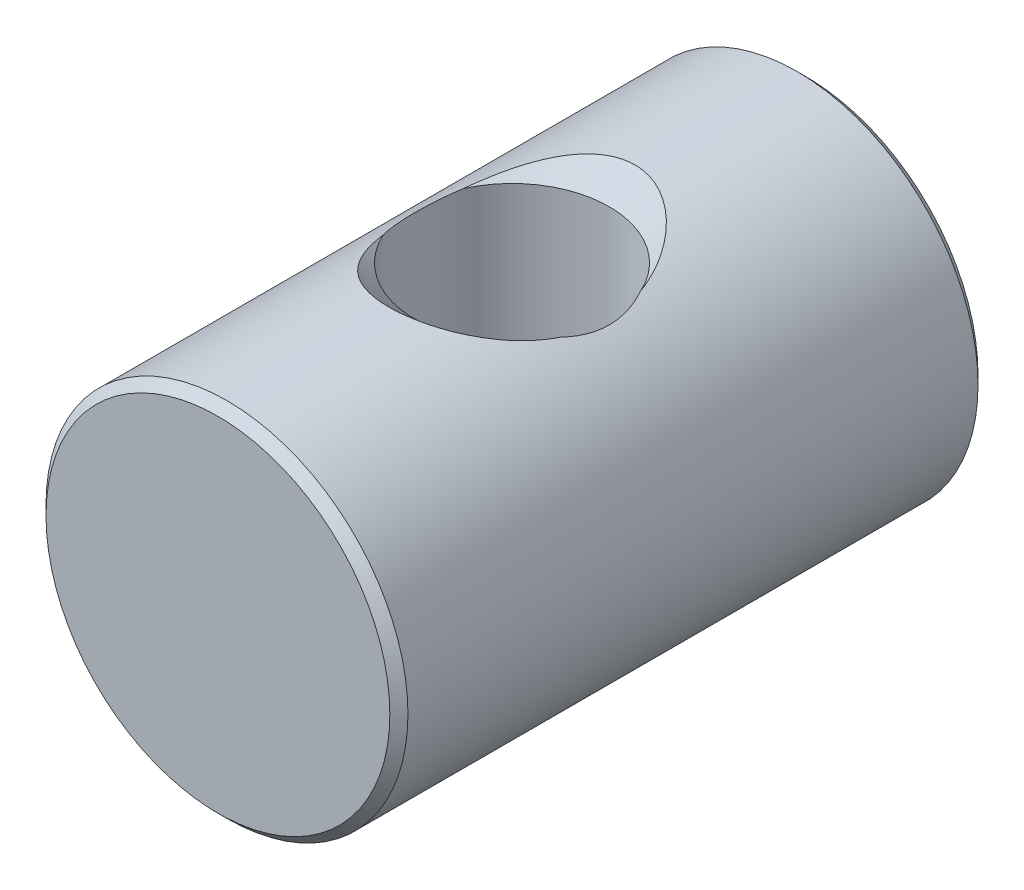
ISO-10303-21;
HEADER;
FILE_DESCRIPTION(('STEP AP214'),'2;1');
FILE_NAME('part.step','',(''),(''),'','','');
FILE_SCHEMA(('AUTOMOTIVE_DESIGN { 1 0 10303 214 1 1 1 1 }'));
ENDSEC;
DATA;
#1=APPLICATION_CONTEXT('core data for automotive mechanical design processes');
#2=APPLICATION_PROTOCOL_DEFINITION('international standard','automotive_design',2000,#1);
#3=PRODUCT_CONTEXT('',#1,'mechanical');
#4=PRODUCT('Part','Part','',(#3));
#5=PRODUCT_RELATED_PRODUCT_CATEGORY('part','',(#4));
#6=PRODUCT_DEFINITION_FORMATION('','',#4);
#7=PRODUCT_DEFINITION_CONTEXT('part definition',#1,'design');
#8=PRODUCT_DEFINITION('design','',#6,#7);
#9=PRODUCT_DEFINITION_SHAPE('','',#8);
#10=(LENGTH_UNIT() NAMED_UNIT(*) SI_UNIT(.MILLI.,.METRE.));
#11=(NAMED_UNIT(*) PLANE_ANGLE_UNIT() SI_UNIT($,.RADIAN.));
#12=(NAMED_UNIT(*) SI_UNIT($,.STERADIAN.) SOLID_ANGLE_UNIT());
#13=UNCERTAINTY_MEASURE_WITH_UNIT(LENGTH_MEASURE(1.E-05),#10,'distance_accuracy_value','');
#14=(GEOMETRIC_REPRESENTATION_CONTEXT(3) GLOBAL_UNCERTAINTY_ASSIGNED_CONTEXT((#13)) GLOBAL_UNIT_ASSIGNED_CONTEXT((#10,
#11,#12)) REPRESENTATION_CONTEXT('',''));
#15=CARTESIAN_POINT('',(0.,0.,0.));
#16=DIRECTION('',(0.,0.,1.));
#17=DIRECTION('',(1.,0.,0.));
#18=AXIS2_PLACEMENT_3D('',#15,#16,#17);
#19=CARTESIAN_POINT('',(0.,0.,-6.5));
#20=DIRECTION('',(0.,0.,-1.));
#21=DIRECTION('',(-1.,0.,0.));
#22=AXIS2_PLACEMENT_3D('',#19,#20,#21);
#23=CYLINDRICAL_SURFACE('',#22,4.);
#24=CARTESIAN_POINT('',(0.,0.,-6.3));
#25=DIRECTION('',(0.,0.,1.));
#26=DIRECTION('',(1.,0.,0.));
#27=AXIS2_PLACEMENT_3D('',#24,#25,#26);
#28=CIRCLE('',#27,4.);
#29=CARTESIAN_POINT('',(4.,0.,-6.3));
#30=VERTEX_POINT('',#29);
#31=EDGE_CURVE('E124',#30,#30,#28,.T.);
#32=ORIENTED_EDGE('',*,*,#31,.T.);
#33=EDGE_LOOP('',(#32));
#34=FACE_BOUND('',#33,.T.);
#35=CARTESIAN_POINT('',(0.,0.,6.3));
#36=DIRECTION('',(0.,0.,-1.));
#37=DIRECTION('',(-1.,0.,0.));
#38=AXIS2_PLACEMENT_3D('',#35,#36,#37);
#39=CIRCLE('',#38,4.);
#40=CARTESIAN_POINT('',(-4.,0.,6.3));
#41=VERTEX_POINT('',#40);
#42=EDGE_CURVE('E128',#41,#41,#39,.T.);
#43=ORIENTED_EDGE('',*,*,#42,.T.);
#44=EDGE_LOOP('',(#43));
#45=FACE_BOUND('',#44,.T.);
#46=CARTESIAN_POINT('',(-1.13868009167572,3.83450233840877,-2.26680152435247));
#47=CARTESIAN_POINT('',(-1.22913400954498,3.80764234677813,-2.18795479583271));
#48=CARTESIAN_POINT('',(-1.31277116482136,3.77933210811259,-2.10180029552216));
#49=CARTESIAN_POINT('',(-1.46664239976113,3.72232506006831,-1.91840227702572));
#50=CARTESIAN_POINT('',(-1.53686237772892,3.69362787753865,-1.8211472615666));
#51=CARTESIAN_POINT('',(-1.67514020363197,3.63325275117174,-1.60076104130454));
#52=CARTESIAN_POINT('',(-1.74080306810364,3.60189692268682,-1.47604102003154));
#53=CARTESIAN_POINT('',(-1.85474402222507,3.5445736138416,-1.21767477158947));
#54=CARTESIAN_POINT('',(-1.90301454273592,3.51860848158764,-1.08402468798402));
#55=CARTESIAN_POINT('',(-1.96602299405228,3.48359874112188,-0.866050445647575));
#56=CARTESIAN_POINT('',(-1.98641876440188,3.47196414779337,-0.783726880400778));
#57=CARTESIAN_POINT('',(-2.02100124364322,3.45194983767719,-0.617402975486123));
#58=CARTESIAN_POINT('',(-2.035189621075,3.44356924628579,-0.53340309276606));
#59=CARTESIAN_POINT('',(-2.05730039036115,3.43040525951531,-0.364317088352816));
#60=CARTESIAN_POINT('',(-2.06522364579568,3.42562136837397,-0.279231118008722));
#61=CARTESIAN_POINT('',(-2.07476617376609,3.41985044114502,-0.108579966700662));
#62=CARTESIAN_POINT('',(-2.07638575356898,3.41886321999217,-0.0230148092978497));
#63=CARTESIAN_POINT('',(-2.07332600521491,3.42071953954111,0.14717039419672));
#64=CARTESIAN_POINT('',(-2.06870464181708,3.42352782842113,0.231791877780995));
#65=CARTESIAN_POINT('',(-2.05328852083175,3.43279570310774,0.400297369251895));
#66=CARTESIAN_POINT('',(-2.0424914999038,3.43925662757271,0.484181095304129));
#67=CARTESIAN_POINT('',(-2.01476398830092,3.45557316761274,0.650645694404581));
#68=CARTESIAN_POINT('',(-1.99783002754782,3.46543070361616,0.733225802710182));
#69=CARTESIAN_POINT('',(-1.95788519024721,3.4881523376356,0.896490449170204));
#70=CARTESIAN_POINT('',(-1.93487202939222,3.50101756560623,0.977174262340381));
#71=CARTESIAN_POINT('',(-1.85658683156489,3.54353905942863,1.21616504446906));
#72=CARTESIAN_POINT('',(-1.79215293746082,3.57706676034234,1.37090342110907));
#73=CARTESIAN_POINT('',(-1.63881554730521,3.64985895392532,1.66620409208919));
#74=CARTESIAN_POINT('',(-1.5499341874523,3.68911824185483,1.80677905425228));
#75=CARTESIAN_POINT('',(-1.37546660235105,3.75688643311354,2.03124359488232));
#76=CARTESIAN_POINT('',(-1.29602316944203,3.78530396022994,2.1199375248025));
#77=CARTESIAN_POINT('',(-1.12370423407312,3.83997763347219,2.28393545174339));
#78=CARTESIAN_POINT('',(-1.03085351752288,3.86623763063782,2.35926359739966));
#79=CARTESIAN_POINT('',(-0.854430905452726,3.90848002399594,2.4773016118518));
#80=CARTESIAN_POINT('',(-0.773466769836338,3.92544570777123,2.52353730349386));
#81=CARTESIAN_POINT('',(-0.604558121117938,3.95497607228491,2.60292057605529));
#82=CARTESIAN_POINT('',(-0.516618708570728,3.96754393312146,2.63607761646026));
#83=CARTESIAN_POINT('',(-0.33490324518429,3.98700889006586,2.687079439996));
#84=CARTESIAN_POINT('',(-0.241084335126254,3.99385741575455,2.70479312784469));
#85=CARTESIAN_POINT('',(-0.0515523975602622,4.00078852895389,2.72272006724461));
#86=CARTESIAN_POINT('',(0.0441592521623334,4.00087586904974,2.72294561159451));
#87=CARTESIAN_POINT('',(0.22132672451028,3.99472676529433,2.7070416752314));
#88=CARTESIAN_POINT('',(0.303014246516223,3.98931331895413,2.69304069569374));
#89=CARTESIAN_POINT('',(0.46287375382159,3.97394076324389,2.65288033815849));
#90=CARTESIAN_POINT('',(0.541044360566328,3.96397988814327,2.62671623724496));
#91=CARTESIAN_POINT('',(0.713294518142828,3.93710116194981,2.55507602756713));
#92=CARTESIAN_POINT('',(0.805799112625673,3.91902137308119,2.50626090355064));
#93=CARTESIAN_POINT('',(0.981127465668514,3.87885613050517,2.39483853997878));
#94=CARTESIAN_POINT('',(1.06393251575837,3.85676313878234,2.33220529747729));
#95=CARTESIAN_POINT('',(1.24664439555626,3.80235203772329,2.17234516886764));
#96=CARTESIAN_POINT('',(1.34239611535187,3.76916115869288,2.07068242666865));
#97=CARTESIAN_POINT('',(1.51587831914797,3.70280426523046,1.85308313736542));
#98=CARTESIAN_POINT('',(1.59358731559366,3.66963832685873,1.73712982014895));
#99=CARTESIAN_POINT('',(1.73336520608027,3.60575789579324,1.49142687517489));
#100=CARTESIAN_POINT('',(1.79498221802352,3.57512801591188,1.36139982556656));
#101=CARTESIAN_POINT('',(1.90017251509647,3.52035163604988,1.09295567117083));
#102=CARTESIAN_POINT('',(1.94374987318551,3.49620367302752,0.954540468344389));
#103=CARTESIAN_POINT('',(1.99849531732733,3.46504584502987,0.730342346702043));
#104=CARTESIAN_POINT('',(2.01561901096681,3.45507406923686,0.646370382899354));
#105=CARTESIAN_POINT('',(2.04352702372108,3.43864288668773,0.477047131131789));
#106=CARTESIAN_POINT('',(2.05431315273971,3.43218247718292,0.391696244126076));
#107=CARTESIAN_POINT('',(2.06949540043282,3.42304932172356,0.220225680816984));
#108=CARTESIAN_POINT('',(2.07389129550306,3.42037670830998,0.134105977717616));
#109=CARTESIAN_POINT('',(2.07626838415384,3.41893426829429,-0.0382509753466371));
#110=CARTESIAN_POINT('',(2.07424987966775,3.42016425799204,-0.124488219587726));
#111=CARTESIAN_POINT('',(2.06392473172288,3.42640501832176,-0.294526689122778));
#112=CARTESIAN_POINT('',(2.05575861444711,3.43133128869948,-0.378339507126983));
#113=CARTESIAN_POINT('',(2.03334867358737,3.44465602826414,-0.544877371473407));
#114=CARTESIAN_POINT('',(2.01910263361414,3.45305576364142,-0.627602009780588));
#115=CARTESIAN_POINT('',(1.96728637183953,3.48302078702156,-0.873423404683745));
#116=CARTESIAN_POINT('',(1.92063936108787,3.50935094105961,-1.03414537929117));
#117=CARTESIAN_POINT('',(1.80259488650595,3.57143482952628,-1.34722745697297));
#118=CARTESIAN_POINT('',(1.73081143991996,3.60733330799467,-1.49941151078282));
#119=CARTESIAN_POINT('',(1.56220764705224,3.68348456717821,-1.78805374493613));
#120=CARTESIAN_POINT('',(1.46542574934026,3.72373060635838,-1.92453561395429));
#121=CARTESIAN_POINT('',(1.28195477916714,3.78981645030572,-2.1339381903247));
#122=CARTESIAN_POINT('',(1.20240164601562,3.81604397912867,-2.21300702129372));
#123=CARTESIAN_POINT('',(1.03139209852941,3.8657634642201,-2.35806360248014));
#124=CARTESIAN_POINT('',(0.939956927743809,3.88926016412621,-2.42407418023152));
#125=CARTESIAN_POINT('',(0.765459991423311,3.92687431655518,-2.52749741508434));
#126=CARTESIAN_POINT('',(0.68443901821694,3.9419276124992,-2.56799344417247));
#127=CARTESIAN_POINT('',(0.516358068594828,3.96743939055082,-2.63587151569448));
#128=CARTESIAN_POINT('',(0.429302588127351,3.97790125174689,-2.66326320367304));
#129=CARTESIAN_POINT('',(0.250636161216269,3.99315159344381,-2.70300549083021));
#130=CARTESIAN_POINT('',(0.158997946345853,3.99790046347985,-2.71525109236046));
#131=CARTESIAN_POINT('',(-0.025095647355344,4.00097884452074,-2.72320257554864));
#132=CARTESIAN_POINT('',(-0.117550720074905,3.99931066628536,-2.71891441096467));
#133=CARTESIAN_POINT('',(-0.289950798721275,3.99030978250944,-2.69559241281303));
#134=CARTESIAN_POINT('',(-0.370162712641729,3.98361293103672,-2.67821316568697));
#135=CARTESIAN_POINT('',(-0.52665364676305,3.96596066898679,-2.63188780450751));
#136=CARTESIAN_POINT('',(-0.602931370759149,3.95500386489931,-2.60293790539033));
#137=CARTESIAN_POINT('',(-0.76100751116624,3.92787574410491,-2.53012558035378));
#138=CARTESIAN_POINT('',(-0.841991555527241,3.9111773327413,-2.48470516510255));
#139=CARTESIAN_POINT('',(-0.996213142902286,3.87477177558153,-2.38322396905477));
#140=CARTESIAN_POINT('',(-1.06944355309358,3.85506189946106,-2.3271535211463));
#141=CARTESIAN_POINT('',(-1.13868009167572,3.83450233840877,-2.26680152435247));
#142=B_SPLINE_CURVE_WITH_KNOTS('',3,(#46,#47,#48,#49,#50,#51,#52,#53,#54,#55,#56,#57,#58,#59,
#60,#61,#62,#63,#64,#65,#66,#67,#68,#69,#70,#71,#72,#73,#74,#75,#76,#77,#78,#79,#80,#81,#82,#83,
#84,#85,#86,#87,#88,#89,#90,#91,#92,#93,#94,#95,#96,#97,#98,#99,#100,#101,#102,#103,#104,#105,
#106,#107,#108,#109,#110,#111,#112,#113,#114,#115,#116,#117,#118,#119,#120,#121,#122,#123,#124,
#125,#126,#127,#128,#129,#130,#131,#132,#133,#134,#135,#136,#137,#138,#139,#140,#141),
.UNSPECIFIED.,.T.,.F.,(4,2,2,2,2,2,2,2,2,2,2,2,2,2,2,2,2,2,2,2,2,2,2,2,2,2,2,2,2,2,2,2,2,2,2,2,
2,2,2,2,2,2,2,2,2,2,2,4),(0.,0.36859659669058,0.737578489422181,1.16925986234264,
1.60112887649787,1.85768406944586,2.11417025822076,2.37062108694707,2.62705941505093,
2.88113229754216,3.13529835589842,3.38960835500488,3.64401404936779,4.15435957062595,
4.66424450710511,5.03030031977377,5.39568787287006,5.67892027789479,5.96194745018695,
6.24735441844876,6.53256076608848,6.78058248725744,7.02870059531464,7.34540029115138,
7.66270111472604,8.09103481400589,8.51987604021094,8.95970801848049,9.39944063807615,
9.65800122886806,9.91648794308779,10.1749837019425,10.4334672932772,10.6862151955081,
10.939055313858,11.444801693902,11.9586817117039,12.4717760205533,12.8162471196383,
13.1601106108359,13.4344980368019,13.7086831860002,13.984758612624,14.2607346346255,
14.5066933233936,14.7527325376409,15.0346119478298,15.316748455448),.UNSPECIFIED.);
#143=CARTESIAN_POINT('',(-1.96058037426627,3.48656343640008,0.882397073908313));
#144=VERTEX_POINT('',#143);
#145=CARTESIAN_POINT('',(1.96058037426626,3.48656343640008,0.882397073908312));
#146=VERTEX_POINT('',#145);
#147=EDGE_CURVE('E131',#144,#146,#142,.T.);
#148=ORIENTED_EDGE('',*,*,#147,.F.);
#149=CARTESIAN_POINT('',(0.,4.,2.15));
#150=CARTESIAN_POINT('',(-0.111985083549888,3.99999241042919,2.14999128277656));
#151=CARTESIAN_POINT('',(-0.224077490488077,3.99524813697612,2.14119897449177));
#152=CARTESIAN_POINT('',(-0.444880967120357,3.97673372012221,2.10644680828375));
#153=CARTESIAN_POINT('',(-0.553586696306077,3.96295000909768,2.08046114369778));
#154=CARTESIAN_POINT('',(-0.764103901168658,3.92778453505629,2.01266622792475));
#155=CARTESIAN_POINT('',(-0.865941452459194,3.90643368940093,1.97092132037537));
#156=CARTESIAN_POINT('',(-1.06097774173743,3.85803554037742,1.87316276031581));
#157=CARTESIAN_POINT('',(-1.15417635573871,3.83098815527048,1.81714890306023));
#158=CARTESIAN_POINT('',(-1.33628687887393,3.77148717336829,1.68822484406198));
#159=CARTESIAN_POINT('',(-1.42449699630782,3.73879318014561,1.61443615835384));
#160=CARTESIAN_POINT('',(-1.58795061149791,3.67235783961419,1.45397702051229));
#161=CARTESIAN_POINT('',(-1.66318256424729,3.63861559096915,1.36729522536174));
#162=CARTESIAN_POINT('',(-1.80560065254837,3.57023950857991,1.17389664475311));
#163=CARTESIAN_POINT('',(-1.87138771426557,3.53581462630107,1.06606629267226));
#164=CARTESIAN_POINT('',(-1.98362962104654,3.47409559446628,0.838885515738043));
#165=CARTESIAN_POINT('',(-2.03009950690743,3.44679590325984,0.719544143174466));
#166=CARTESIAN_POINT('',(-2.09914059071748,3.40516584404437,0.48022390935699));
#167=CARTESIAN_POINT('',(-2.12302804619301,3.390129360264,0.360754612895827));
#168=CARTESIAN_POINT('',(-2.15016503034598,3.37299276237296,0.118641928919221));
#169=CARTESIAN_POINT('',(-2.15344146062833,3.37087578577,-0.00399711128932178));
#170=CARTESIAN_POINT('',(-2.14022339446677,3.37926908617843,-0.229962173585581));
#171=CARTESIAN_POINT('',(-2.12649902744201,3.38801064528115,-0.333533803028741));
#172=CARTESIAN_POINT('',(-2.08454378577752,3.41398306573744,-0.536591721316311));
#173=CARTESIAN_POINT('',(-2.05630689414518,3.43121744815182,-0.636076297149736));
#174=CARTESIAN_POINT('',(-1.98570998012338,3.47255686356862,-0.830929263131551));
#175=CARTESIAN_POINT('',(-1.94304940884755,3.49680637319131,-0.926156625609887));
#176=CARTESIAN_POINT('',(-1.84506639648014,3.5494819153084,-1.1085862709489));
#177=CARTESIAN_POINT('',(-1.78973837354591,3.57790978699198,-1.19578499221185));
#178=CARTESIAN_POINT('',(-1.65837107693041,3.64086026982543,-1.37341273093259));
#179=CARTESIAN_POINT('',(-1.58047165721853,3.67565843778587,-1.46237351827334));
#180=CARTESIAN_POINT('',(-1.41085349097821,3.74404329998364,-1.62663503890995));
#181=CARTESIAN_POINT('',(-1.31912612856053,3.77762922261182,-1.701927190649));
#182=CARTESIAN_POINT('',(-1.11741582683789,3.84229866335277,-1.84113854654299));
#183=CARTESIAN_POINT('',(-1.00665800192928,3.87310210413084,-1.90407618794186));
#184=CARTESIAN_POINT('',(-0.774065516608711,3.92619426387664,-2.00987626675681));
#185=CARTESIAN_POINT('',(-0.65224099574513,3.94849068166452,-2.05275686369366));
#186=CARTESIAN_POINT('',(-0.412797211692433,3.98030644034244,-2.11327610529378));
#187=CARTESIAN_POINT('',(-0.295799016079743,3.99080138540045,-2.13285172730296));
#188=CARTESIAN_POINT('',(-0.0597330243300749,4.00129452271238,-2.15242504257926));
#189=CARTESIAN_POINT('',(0.0593335028211626,4.00129893855782,-2.15243434372452));
#190=CARTESIAN_POINT('',(0.284399869544178,3.99132016755876,-2.13381845714079));
#191=CARTESIAN_POINT('',(0.390590169182916,3.98226017773824,-2.11691572619681));
#192=CARTESIAN_POINT('',(0.5983666934953,3.95637725730819,-2.06781417243429));
#193=CARTESIAN_POINT('',(0.699952441373295,3.93955352478026,-2.03561376950631));
#194=CARTESIAN_POINT('',(0.898571189153843,3.89911528070355,-1.95621904340604));
#195=CARTESIAN_POINT('',(0.995433013705822,3.87534533639925,-1.9086785926811));
#196=CARTESIAN_POINT('',(1.18007767122399,3.82317096683462,-1.80038507209051));
#197=CARTESIAN_POINT('',(1.26785699498088,3.79476476110472,-1.73962692321898));
#198=CARTESIAN_POINT('',(1.44200674702241,3.73230165289247,-1.59905124652109));
#199=CARTESIAN_POINT('',(1.52718528640786,3.69796619892198,-1.51787941629346));
#200=CARTESIAN_POINT('',(1.68333503411259,3.62955448193818,-1.3426378968988));
#201=CARTESIAN_POINT('',(1.75429266230863,3.59547849628594,-1.2485560224493));
#202=CARTESIAN_POINT('',(1.88480969934338,3.5289133178125,-1.04207727077678));
#203=CARTESIAN_POINT('',(1.94322649819339,3.49670129160335,-0.928860059841313));
#204=CARTESIAN_POINT('',(2.03959121842096,3.44139375848823,-0.691992549539828));
#205=CARTESIAN_POINT('',(2.07756851157813,3.41828518270863,-0.568357517984742));
#206=CARTESIAN_POINT('',(2.1282114277317,3.38696436894619,-0.326950917566542));
#207=CARTESIAN_POINT('',(2.14298986871183,3.3775159604708,-0.209789049125651));
#208=CARTESIAN_POINT('',(2.15306681805449,3.37110589298399,0.0256777216911734));
#209=CARTESIAN_POINT('',(2.14837939204122,3.37413521781325,0.143981737127413));
#210=CARTESIAN_POINT('',(2.12169848755743,3.39095526288104,0.362616602337587));
#211=CARTESIAN_POINT('',(2.10194354886376,3.4033522024359,0.463344313817301));
#212=CARTESIAN_POINT('',(2.04876867511861,3.43562345400984,0.659860047565285));
#213=CARTESIAN_POINT('',(2.01534355158559,3.45550060489385,0.755646178707997));
#214=CARTESIAN_POINT('',(1.93346217813749,3.50200902421991,0.946404157955806));
#215=CARTESIAN_POINT('',(1.88418349989918,3.52899009970315,1.04093477137835));
#216=CARTESIAN_POINT('',(1.77280466826672,3.58623565491193,1.2210195942933));
#217=CARTESIAN_POINT('',(1.71069762135228,3.61650189580489,1.30656894013001));
#218=CARTESIAN_POINT('',(1.56471752559222,3.68224952917989,1.47944883038026));
#219=CARTESIAN_POINT('',(1.47898463326489,3.71784105438733,1.56517694122781));
#220=CARTESIAN_POINT('',(1.29366436225304,3.78631896326831,1.72152620498906));
#221=CARTESIAN_POINT('',(1.19406785553323,3.81920354175472,1.79213732624229));
#222=CARTESIAN_POINT('',(0.979989617524254,3.87972360692406,1.91777937524023));
#223=CARTESIAN_POINT('',(0.865181032785215,3.90719519253341,1.9723431251943));
#224=CARTESIAN_POINT('',(0.686122175517974,3.94118669682048,2.03857749900147));
#225=CARTESIAN_POINT('',(0.625333387256217,3.95131064062383,2.05804674413557));
#226=CARTESIAN_POINT('',(0.501914482823138,3.96887321153499,2.09156917162548));
#227=CARTESIAN_POINT('',(0.439285393872386,3.97631330704083,2.10562531590446));
#228=CARTESIAN_POINT('',(0.314167999233181,3.98812704014167,2.12784962585061));
#229=CARTESIAN_POINT('',(0.251708114126208,3.99256578620078,2.13614292368601));
#230=CARTESIAN_POINT('',(0.126176849031563,3.99850441465378,2.14722058584166));
#231=CARTESIAN_POINT('',(0.063105464844301,4.00000427684991,2.15000491230099));
#232=CARTESIAN_POINT('',(0.,4.,2.15));
#233=B_SPLINE_CURVE_WITH_KNOTS('',3,(#149,#150,#151,#152,#153,#154,#155,#156,#157,#158,#159,
#160,#161,#162,#163,#164,#165,#166,#167,#168,#169,#170,#171,#172,#173,#174,#175,#176,#177,#178,
#179,#180,#181,#182,#183,#184,#185,#186,#187,#188,#189,#190,#191,#192,#193,#194,#195,#196,#197,
#198,#199,#200,#201,#202,#203,#204,#205,#206,#207,#208,#209,#210,#211,#212,#213,#214,#215,#216,
#217,#218,#219,#220,#221,#222,#223,#224,#225,#226,#227,#228,#229,#230,#231,#232),.UNSPECIFIED.,
.T.,.F.,(4,2,2,2,2,2,2,2,2,2,2,2,2,2,2,2,2,2,2,2,2,2,2,2,2,2,2,2,2,2,2,2,2,2,2,2,2,2,2,2,2,4),
(0.,0.335710391978374,0.671925820794776,1.00678310241753,1.34164518918348,1.69886736408739,
2.05640569313897,2.44719722292653,2.83768390091528,3.20367633738305,3.56919097955531,
3.88224513770468,4.19542919509354,4.51558861443919,4.83588938271311,5.20410660078069,
5.57255420254336,5.96361403901208,6.35431912374402,6.70958078958073,7.06463169350078,
7.38686237569236,7.70912634860158,8.03924028022703,8.36948128552757,8.73564475995621,
9.10215624984545,9.49427270335817,9.88582416673056,10.23906912323,10.5920588768167,
10.9008858996851,11.2098302459518,11.5384708215192,11.8672884587277,12.2446617203924,
12.622284636653,13.0100066433899,13.2036355995073,13.3971584553028,13.5863355677526,
13.7755139803349),.UNSPECIFIED.);
#234=CARTESIAN_POINT('',(-1.96058037426627,3.48656343640008,-0.882397073908313));
#235=VERTEX_POINT('',#234);
#236=EDGE_CURVE('E81',#144,#235,#233,.T.);
#237=ORIENTED_EDGE('',*,*,#236,.T.);
#238=CARTESIAN_POINT('',(1.96058037426627,3.48656343640008,-0.882397073908313));
#239=VERTEX_POINT('',#238);
#240=EDGE_CURVE('E137',#239,#235,#142,.T.);
#241=ORIENTED_EDGE('',*,*,#240,.F.);
#242=EDGE_CURVE('E85',#239,#146,#233,.T.);
#243=ORIENTED_EDGE('',*,*,#242,.T.);
#244=EDGE_LOOP('',(#148,#237,#241,#243));
#245=FACE_BOUND('',#244,.T.);
#246=CARTESIAN_POINT('',(-1.13868009167572,-3.83450233840877,-2.26680152435247));
#247=CARTESIAN_POINT('',(-1.04727643503845,-3.86164668182633,-2.34647996412133));
#248=CARTESIAN_POINT('',(-0.948812153163089,-3.88734270645163,-2.4187904515656));
#249=CARTESIAN_POINT('',(-0.738644085748892,-3.93266317212763,-2.54342581822874));
#250=CARTESIAN_POINT('',(-0.62697132494217,-3.95230146493057,-2.59579635788922));
#251=CARTESIAN_POINT('',(-0.431720532256799,-3.97742797554459,-2.66206506318819));
#252=CARTESIAN_POINT('',(-0.350820224628851,-3.98544107814517,-2.682936409024));
#253=CARTESIAN_POINT('',(-0.186423858626647,-3.99649908978516,-2.71165203528605));
#254=CARTESIAN_POINT('',(-0.102930349894541,-3.99954873058914,-2.71950872296606));
#255=CARTESIAN_POINT('',(0.0643762672257333,-4.00035836930451,-2.72159890615551));
#256=CARTESIAN_POINT('',(0.148189666535484,-3.99811047272862,-2.71581206982992));
#257=CARTESIAN_POINT('',(0.313544433595706,-3.98855351373494,-2.69103292656679));
#258=CARTESIAN_POINT('',(0.395084732072957,-3.9812421098667,-2.67203451035703));
#259=CARTESIAN_POINT('',(0.553379600825367,-3.96233488696316,-2.62231387466117));
#260=CARTESIAN_POINT('',(0.630159810876644,-3.95076487797616,-2.59166224550576));
#261=CARTESIAN_POINT('',(0.778248083542928,-3.92428351641232,-2.52033712614954));
#262=CARTESIAN_POINT('',(0.849553629630565,-3.9093706394258,-2.47965906286375));
#263=CARTESIAN_POINT('',(1.02092105869559,-3.86897137227013,-2.36706993973818));
#264=CARTESIAN_POINT('',(1.11711765843578,-3.84196968992151,-2.28980678965569));
#265=CARTESIAN_POINT('',(1.29531013735841,-3.78562444748259,-2.12099903314684));
#266=CARTESIAN_POINT('',(1.3772686087839,-3.75627500566646,-2.02941797247503));
#267=CARTESIAN_POINT('',(1.55029808956896,-3.68885556193437,-1.80563628639659));
#268=CARTESIAN_POINT('',(1.63644221795242,-3.65087448694321,-1.66959685002732));
#269=CARTESIAN_POINT('',(1.78576154717596,-3.58020574938783,-1.38432303966885));
#270=CARTESIAN_POINT('',(1.8489267644284,-3.54752039105214,-1.23508296535468));
#271=CARTESIAN_POINT('',(1.9530871083536,-3.49127863098891,-0.925417129264317));
#272=CARTESIAN_POINT('',(1.99383122035493,-3.46782639399957,-0.764886550532306));
#273=CARTESIAN_POINT('',(2.03718173185243,-3.4424033805856,-0.5201473014972));
#274=CARTESIAN_POINT('',(2.04867118083652,-3.43555476578993,-0.437903165536127));
#275=CARTESIAN_POINT('',(2.06569704367975,-3.42534707793551,-0.27259382638107));
#276=CARTESIAN_POINT('',(2.07123555983677,-3.42198677256897,-0.189528923613519));
#277=CARTESIAN_POINT('',(2.07639276065502,-3.41885961180599,-0.0211104671447954));
#278=CARTESIAN_POINT('',(2.07586292844019,-3.41918290795962,0.0642492537083712));
#279=CARTESIAN_POINT('',(2.06852898246339,-3.42362468031108,0.234600841723383));
#280=CARTESIAN_POINT('',(2.06172466437444,-3.42774328010198,0.31959269681522));
#281=CARTESIAN_POINT('',(2.04187019031562,-3.43960768442431,0.48864587547342));
#282=CARTESIAN_POINT('',(2.02881605375219,-3.4473558005757,0.572706571012001));
#283=CARTESIAN_POINT('',(1.99651774891251,-3.46615906332159,0.739262785371567));
#284=CARTESIAN_POINT('',(1.97727133413291,-3.47721541001061,0.82175772463002));
#285=CARTESIAN_POINT('',(1.91076076050311,-3.51448575937681,1.06445644517245));
#286=CARTESIAN_POINT('',(1.85451513353492,-3.5449413446756,1.22165894448306));
#287=CARTESIAN_POINT('',(1.71803145317484,-3.61305494603287,1.52356352795691));
#288=CARTESIAN_POINT('',(1.6378015364145,-3.65071051794866,1.66826983001119));
#289=CARTESIAN_POINT('',(1.47365151755114,-3.71945785112999,1.90945463038194));
#290=CARTESIAN_POINT('',(1.3946852664759,-3.7501039628498,2.00943208049028));
#291=CARTESIAN_POINT('',(1.22148188729846,-3.81003290841617,2.19561500445393));
#292=CARTESIAN_POINT('',(1.12727372422688,-3.83931819504018,2.2818459962001));
#293=CARTESIAN_POINT('',(0.94893606612195,-3.88661508050513,2.4166945025527));
#294=CARTESIAN_POINT('',(0.868124554030259,-3.9056193145866,2.4693332984866));
#295=CARTESIAN_POINT('',(0.698503835798781,-3.93948588036602,2.56157003635516));
#296=CARTESIAN_POINT('',(0.609700014225271,-3.95435097344539,2.60117667576718));
#297=CARTESIAN_POINT('',(0.424840258189342,-3.97847493062291,2.66484971698339));
#298=CARTESIAN_POINT('',(0.328721060786791,-3.98767665269726,2.68875788111605));
#299=CARTESIAN_POINT('',(0.133303767828047,-3.99897052615603,2.71804353577539));
#300=CARTESIAN_POINT('',(0.0340092240217902,-4.00107035859707,2.72344104660827));
#301=CARTESIAN_POINT('',(-0.14869409739108,-3.99812061934356,2.71581795407691));
#302=CARTESIAN_POINT('',(-0.232244604386254,-3.99409948622169,2.70544706052907));
#303=CARTESIAN_POINT('',(-0.39629586814353,-3.98117084623867,2.67180386915102));
#304=CARTESIAN_POINT('',(-0.476795933863548,-3.9722622391684,2.64852866644608));
#305=CARTESIAN_POINT('',(-0.633577619753284,-3.95030497099547,2.59037605959361));
#306=CARTESIAN_POINT('',(-0.709819616122721,-3.93722323500135,2.55540585368603));
#307=CARTESIAN_POINT('',(-0.856353464480199,-3.90797286778573,2.47574506550157));
#308=CARTESIAN_POINT('',(-0.926642490093885,-3.89180278199404,2.43104990151676));
#309=CARTESIAN_POINT('',(-1.09795338196774,-3.84786666077849,2.30667726124684));
#310=CARTESIAN_POINT('',(-1.19448672721675,-3.81863152047392,2.2213192972683));
#311=CARTESIAN_POINT('',(-1.37209924374643,-3.75848116462973,2.036218993796));
#312=CARTESIAN_POINT('',(-1.45313601728734,-3.72756162908497,1.93643846686316));
#313=CARTESIAN_POINT('',(-1.6204845167664,-3.65846188186927,1.6969354055311));
#314=CARTESIAN_POINT('',(-1.70205540940359,-3.62063893527864,1.5537988608273));
#315=CARTESIAN_POINT('',(-1.84136393975812,-3.55182084639675,1.25487203390898));
#316=CARTESIAN_POINT('',(-1.89909884720508,-3.520826486469,1.09908030456288));
#317=CARTESIAN_POINT('',(-1.96795927584488,-3.48250032977483,0.858532122393397));
#318=CARTESIAN_POINT('',(-1.98799917378339,-3.47105712163034,0.776870744878831));
#319=CARTESIAN_POINT('',(-2.02197524165164,-3.4513777956329,0.611916402176925));
#320=CARTESIAN_POINT('',(-2.03591359950895,-3.44314052829179,0.528624033052081));
#321=CARTESIAN_POINT('',(-2.05762620090133,-3.43020886658891,0.361031118104038));
#322=CARTESIAN_POINT('',(-2.06540482421883,-3.42551195502739,0.276731331960265));
#323=CARTESIAN_POINT('',(-2.07477522328254,-3.41984480523667,0.107662864359969));
#324=CARTESIAN_POINT('',(-2.07636710931678,-3.41887450057503,0.0228941912890478));
#325=CARTESIAN_POINT('',(-2.07335525804558,-3.42070182211669,-0.146452061005019));
#326=CARTESIAN_POINT('',(-2.06875442813434,-3.42349768015934,-0.231029711241344));
#327=CARTESIAN_POINT('',(-2.05338572979406,-3.43273747626761,-0.399450843024803));
#328=CARTESIAN_POINT('',(-2.04261554869062,-3.43918278237347,-0.4832940372767));
#329=CARTESIAN_POINT('',(-2.01493898817925,-3.4554710293285,-0.649735986302169));
#330=CARTESIAN_POINT('',(-1.99802508706082,-3.46531813424832,-0.732333085828851));
#331=CARTESIAN_POINT('',(-1.95811808545981,-3.48802143710293,-0.895633042228544));
#332=CARTESIAN_POINT('',(-1.93512277665361,-3.50087872792268,-0.976335199382727));
#333=CARTESIAN_POINT('',(-1.85684089663532,-3.54340643365767,-1.21553618605767));
#334=CARTESIAN_POINT('',(-1.79236983669841,-3.57696038944177,-1.370453100741));
#335=CARTESIAN_POINT('',(-1.6390495198168,-3.64975126747253,-1.66578599135702));
#336=CARTESIAN_POINT('',(-1.55027911266981,-3.68896961795784,-1.80624688168762));
#337=CARTESIAN_POINT('',(-1.4026071359744,-3.74635087986035,-1.99636540073559));
#338=CARTESIAN_POINT('',(-1.35366422434459,-3.76438224742509,-2.05391113386805));
#339=CARTESIAN_POINT('',(-1.25030103292666,-3.79996603705731,-2.16420480627357));
#340=CARTESIAN_POINT('',(-1.19587274855317,-3.81751771026195,-2.21694551383952));
#341=CARTESIAN_POINT('',(-1.13868009167572,-3.83450233840877,-2.26680152435247));
#342=B_SPLINE_CURVE_WITH_KNOTS('',3,(#246,#247,#248,#249,#250,#251,#252,#253,#254,#255,#256,
#257,#258,#259,#260,#261,#262,#263,#264,#265,#266,#267,#268,#269,#270,#271,#272,#273,#274,#275,
#276,#277,#278,#279,#280,#281,#282,#283,#284,#285,#286,#287,#288,#289,#290,#291,#292,#293,#294,
#295,#296,#297,#298,#299,#300,#301,#302,#303,#304,#305,#306,#307,#308,#309,#310,#311,#312,#313,
#314,#315,#316,#317,#318,#319,#320,#321,#322,#323,#324,#325,#326,#327,#328,#329,#330,#331,#332,
#333,#334,#335,#336,#337,#338,#339,#340,#341),.UNSPECIFIED.,.T.,.F.,(4,2,2,2,2,2,2,2,2,2,2,2,2,
2,2,2,2,2,2,2,2,2,2,2,2,2,2,2,2,2,2,2,2,2,2,2,2,2,2,2,2,2,2,2,2,2,2,4),(0.,0.372465556483094,
0.744073000569911,0.994798895124506,1.24528562751041,1.4961458758021,1.74712220358989,
1.99660183860734,2.24619547323769,2.62299351016271,3.00076700781831,3.49451629225208,
3.98847983917718,4.4878665156397,4.73760229906527,4.98724982879776,5.24302003379746,
5.49879856818092,5.75474022852129,6.01077484711576,6.51750311160363,7.02405966405434,
7.41585523645326,7.80691481998839,8.10074326230376,8.3943752080327,8.69092323737036,
8.98715043211537,9.23879475317799,9.49049574462845,9.74424338540365,9.99811083386027,
10.3923062846735,10.7875652672248,11.2921524778456,11.7967974699063,12.0511306034609,
12.3053724618283,12.5594333827912,12.8134897747097,13.0674269322713,13.321459344363,
13.5758038205286,13.8302407831721,14.3411574085424,14.8504354038441,15.0831481168567,
15.3162054753291),.UNSPECIFIED.);
#343=CARTESIAN_POINT('',(1.96058037426627,-3.48656343640008,0.882397073908313));
#344=VERTEX_POINT('',#343);
#345=CARTESIAN_POINT('',(-1.96058037426626,-3.48656343640008,0.882397073908313));
#346=VERTEX_POINT('',#345);
#347=EDGE_CURVE('E45',#344,#346,#342,.T.);
#348=ORIENTED_EDGE('',*,*,#347,.F.);
#349=CARTESIAN_POINT('',(0.,-4.,2.15));
#350=CARTESIAN_POINT('',(0.111985083549888,-3.99999241042919,2.14999128277656));
#351=CARTESIAN_POINT('',(0.224077490488077,-3.99524813697612,2.14119897449177));
#352=CARTESIAN_POINT('',(0.444880967120357,-3.97673372012221,2.10644680828375));
#353=CARTESIAN_POINT('',(0.553586696306076,-3.96295000909768,2.08046114369778));
#354=CARTESIAN_POINT('',(0.764103901168658,-3.92778453505629,2.01266622792475));
#355=CARTESIAN_POINT('',(0.865941452459194,-3.90643368940093,1.97092132037538));
#356=CARTESIAN_POINT('',(1.06097774173743,-3.85803554037741,1.87316276031581));
#357=CARTESIAN_POINT('',(1.15417635573871,-3.83098815527048,1.81714890306023));
#358=CARTESIAN_POINT('',(1.33628687887393,-3.77148717336829,1.68822484406198));
#359=CARTESIAN_POINT('',(1.42449699630782,-3.73879318014561,1.61443615835384));
#360=CARTESIAN_POINT('',(1.58795061149791,-3.67235783961419,1.45397702051229));
#361=CARTESIAN_POINT('',(1.66318256424729,-3.63861559096915,1.36729522536174));
#362=CARTESIAN_POINT('',(1.80560065254837,-3.57023950857991,1.17389664475311));
#363=CARTESIAN_POINT('',(1.87138771426557,-3.53581462630107,1.06606629267226));
#364=CARTESIAN_POINT('',(1.98362962104654,-3.47409559446628,0.838885515738042));
#365=CARTESIAN_POINT('',(2.03009950690743,-3.44679590325984,0.719544143174466));
#366=CARTESIAN_POINT('',(2.09914059071749,-3.40516584404437,0.480223909356989));
#367=CARTESIAN_POINT('',(2.12302804619301,-3.390129360264,0.360754612895827));
#368=CARTESIAN_POINT('',(2.15016503034598,-3.37299276237296,0.118641928919221));
#369=CARTESIAN_POINT('',(2.15344146062833,-3.37087578577,-0.00399711128932209));
#370=CARTESIAN_POINT('',(2.14022339446677,-3.37926908617843,-0.229962173585582));
#371=CARTESIAN_POINT('',(2.12649902744201,-3.38801064528115,-0.333533803028742));
#372=CARTESIAN_POINT('',(2.08454378577752,-3.41398306573744,-0.536591721316311));
#373=CARTESIAN_POINT('',(2.05630689414518,-3.43121744815182,-0.636076297149736));
#374=CARTESIAN_POINT('',(1.98570998012338,-3.47255686356862,-0.830929263131551));
#375=CARTESIAN_POINT('',(1.94304940884755,-3.49680637319131,-0.926156625609887));
#376=CARTESIAN_POINT('',(1.84506639648014,-3.5494819153084,-1.1085862709489));
#377=CARTESIAN_POINT('',(1.78973837354591,-3.57790978699198,-1.19578499221185));
#378=CARTESIAN_POINT('',(1.65837107693041,-3.64086026982543,-1.37341273093259));
#379=CARTESIAN_POINT('',(1.58047165721853,-3.67565843778587,-1.46237351827334));
#380=CARTESIAN_POINT('',(1.41085349097821,-3.74404329998364,-1.62663503890995));
#381=CARTESIAN_POINT('',(1.31912612856053,-3.77762922261182,-1.701927190649));
#382=CARTESIAN_POINT('',(1.11741582683789,-3.84229866335277,-1.84113854654299));
#383=CARTESIAN_POINT('',(1.00665800192928,-3.87310210413084,-1.90407618794186));
#384=CARTESIAN_POINT('',(0.774065516608712,-3.92619426387664,-2.00987626675681));
#385=CARTESIAN_POINT('',(0.652240995745131,-3.94849068166452,-2.05275686369366));
#386=CARTESIAN_POINT('',(0.412797211692433,-3.98030644034244,-2.11327610529378));
#387=CARTESIAN_POINT('',(0.295799016079744,-3.99080138540045,-2.13285172730296));
#388=CARTESIAN_POINT('',(0.0597330243300754,-4.00129452271238,-2.15242504257926));
#389=CARTESIAN_POINT('',(-0.0593335028211621,-4.00129893855782,-2.15243434372452));
#390=CARTESIAN_POINT('',(-0.284399869544177,-3.99132016755876,-2.13381845714079));
#391=CARTESIAN_POINT('',(-0.390590169182915,-3.98226017773824,-2.11691572619681));
#392=CARTESIAN_POINT('',(-0.598366693495299,-3.95637725730819,-2.06781417243429));
#393=CARTESIAN_POINT('',(-0.699952441373294,-3.93955352478026,-2.03561376950631));
#394=CARTESIAN_POINT('',(-0.898571189153842,-3.89911528070355,-1.95621904340604));
#395=CARTESIAN_POINT('',(-0.995433013705822,-3.87534533639925,-1.9086785926811));
#396=CARTESIAN_POINT('',(-1.18007767122399,-3.82317096683462,-1.80038507209051));
#397=CARTESIAN_POINT('',(-1.26785699498088,-3.79476476110472,-1.73962692321898));
#398=CARTESIAN_POINT('',(-1.44200674702241,-3.73230165289247,-1.59905124652109));
#399=CARTESIAN_POINT('',(-1.52718528640786,-3.69796619892198,-1.51787941629346));
#400=CARTESIAN_POINT('',(-1.68333503411259,-3.62955448193818,-1.3426378968988));
#401=CARTESIAN_POINT('',(-1.75429266230863,-3.59547849628594,-1.2485560224493));
#402=CARTESIAN_POINT('',(-1.88480969934338,-3.5289133178125,-1.04207727077678));
#403=CARTESIAN_POINT('',(-1.94322649819339,-3.49670129160335,-0.928860059841314));
#404=CARTESIAN_POINT('',(-2.03959121842096,-3.44139375848823,-0.691992549539828));
#405=CARTESIAN_POINT('',(-2.07756851157813,-3.41828518270863,-0.568357517984743));
#406=CARTESIAN_POINT('',(-2.1282114277317,-3.38696436894619,-0.326950917566543));
#407=CARTESIAN_POINT('',(-2.14298986871183,-3.3775159604708,-0.209789049125652));
#408=CARTESIAN_POINT('',(-2.15306681805449,-3.37110589298399,0.0256777216911727));
#409=CARTESIAN_POINT('',(-2.14837939204122,-3.37413521781326,0.143981737127412));
#410=CARTESIAN_POINT('',(-2.12169848755743,-3.39095526288104,0.362616602337586));
#411=CARTESIAN_POINT('',(-2.10194354886376,-3.4033522024359,0.463344313817301));
#412=CARTESIAN_POINT('',(-2.04876867511861,-3.43562345400984,0.659860047565285));
#413=CARTESIAN_POINT('',(-2.01534355158559,-3.45550060489385,0.755646178707997));
#414=CARTESIAN_POINT('',(-1.9334621781375,-3.50200902421991,0.946404157955805));
#415=CARTESIAN_POINT('',(-1.88418349989918,-3.52899009970315,1.04093477137835));
#416=CARTESIAN_POINT('',(-1.77280466826672,-3.58623565491193,1.2210195942933));
#417=CARTESIAN_POINT('',(-1.71069762135229,-3.61650189580489,1.30656894013001));
#418=CARTESIAN_POINT('',(-1.56471752559222,-3.68224952917989,1.47944883038026));
#419=CARTESIAN_POINT('',(-1.47898463326489,-3.71784105438733,1.56517694122781));
#420=CARTESIAN_POINT('',(-1.29366436225304,-3.78631896326831,1.72152620498906));
#421=CARTESIAN_POINT('',(-1.19406785553323,-3.81920354175472,1.79213732624229));
#422=CARTESIAN_POINT('',(-0.979989617524255,-3.87972360692406,1.91777937524023));
#423=CARTESIAN_POINT('',(-0.865181032785216,-3.90719519253341,1.9723431251943));
#424=CARTESIAN_POINT('',(-0.686122175517975,-3.94118669682048,2.03857749900147));
#425=CARTESIAN_POINT('',(-0.625333387256218,-3.95131064062383,2.05804674413557));
#426=CARTESIAN_POINT('',(-0.501914482823139,-3.96887321153499,2.09156917162548));
#427=CARTESIAN_POINT('',(-0.439285393872386,-3.97631330704083,2.10562531590446));
#428=CARTESIAN_POINT('',(-0.314167999233181,-3.98812704014167,2.12784962585061));
#429=CARTESIAN_POINT('',(-0.251708114126208,-3.99256578620078,2.13614292368601));
#430=CARTESIAN_POINT('',(-0.126176849031563,-3.99850441465378,2.14722058584166));
#431=CARTESIAN_POINT('',(-0.0631054648443011,-4.00000427684991,2.15000491230099));
#432=CARTESIAN_POINT('',(0.,-4.,2.15));
#433=B_SPLINE_CURVE_WITH_KNOTS('',3,(#349,#350,#351,#352,#353,#354,#355,#356,#357,#358,#359,
#360,#361,#362,#363,#364,#365,#366,#367,#368,#369,#370,#371,#372,#373,#374,#375,#376,#377,#378,
#379,#380,#381,#382,#383,#384,#385,#386,#387,#388,#389,#390,#391,#392,#393,#394,#395,#396,#397,
#398,#399,#400,#401,#402,#403,#404,#405,#406,#407,#408,#409,#410,#411,#412,#413,#414,#415,#416,
#417,#418,#419,#420,#421,#422,#423,#424,#425,#426,#427,#428,#429,#430,#431,#432),.UNSPECIFIED.,
.T.,.F.,(4,2,2,2,2,2,2,2,2,2,2,2,2,2,2,2,2,2,2,2,2,2,2,2,2,2,2,2,2,2,2,2,2,2,2,2,2,2,2,2,2,4),
(0.,0.335710391978374,0.671925820794776,1.00678310241753,1.34164518918348,1.69886736408739,
2.05640569313897,2.44719722292653,2.83768390091528,3.20367633738305,3.56919097955531,
3.88224513770468,4.19542919509354,4.51558861443919,4.83588938271311,5.20410660078069,
5.57255420254336,5.96361403901208,6.35431912374402,6.70958078958072,7.06463169350078,
7.38686237569236,7.70912634860158,8.03924028022703,8.36948128552757,8.73564475995621,
9.10215624984545,9.49427270335817,9.88582416673056,10.23906912323,10.5920588768167,
10.9008858996851,11.2098302459518,11.5384708215192,11.8672884587277,12.2446617203924,
12.622284636653,13.0100066433899,13.2036355995073,13.3971584553028,13.5863355677526,
13.7755139803349),.UNSPECIFIED.);
#434=CARTESIAN_POINT('',(1.96058037426627,-3.48656343640008,-0.882397073908313));
#435=VERTEX_POINT('',#434);
#436=EDGE_CURVE('E78',#344,#435,#433,.T.);
#437=ORIENTED_EDGE('',*,*,#436,.T.);
#438=CARTESIAN_POINT('',(-1.96058037426627,-3.48656343640008,-0.882397073908313));
#439=VERTEX_POINT('',#438);
#440=EDGE_CURVE('E52',#439,#435,#342,.T.);
#441=ORIENTED_EDGE('',*,*,#440,.F.);
#442=EDGE_CURVE('E77',#439,#346,#433,.T.);
#443=ORIENTED_EDGE('',*,*,#442,.T.);
#444=EDGE_LOOP('',(#348,#437,#441,#443));
#445=FACE_BOUND('',#444,.T.);
#446=ADVANCED_FACE('F32',(#34,#45,#245,#445),#23,.T.);
#447=CARTESIAN_POINT('',(0.,-4.,0.));
#448=DIRECTION('',(0.,1.,0.));
#449=DIRECTION('',(0.,0.,1.));
#450=AXIS2_PLACEMENT_3D('',#447,#448,#449);
#451=CYLINDRICAL_SURFACE('',#450,2.15);
#452=CARTESIAN_POINT('',(0.,3.48656343640008,0.));
#453=DIRECTION('',(0.,1.,0.));
#454=DIRECTION('',(0.,0.,1.));
#455=AXIS2_PLACEMENT_3D('',#452,#453,#454);
#456=CIRCLE('',#455,2.15);
#457=EDGE_CURVE('E74',#235,#239,#456,.F.);
#458=ORIENTED_EDGE('',*,*,#457,.F.);
#459=ORIENTED_EDGE('',*,*,#236,.F.);
#460=EDGE_CURVE('E83',#146,#144,#456,.F.);
#461=ORIENTED_EDGE('',*,*,#460,.F.);
#462=ORIENTED_EDGE('',*,*,#242,.F.);
#463=EDGE_LOOP('',(#458,#459,#461,#462));
#464=FACE_BOUND('',#463,.T.);
#465=CARTESIAN_POINT('',(0.,-3.48656343640008,0.));
#466=DIRECTION('',(0.,-1.,0.));
#467=DIRECTION('',(0.,0.,-1.));
#468=AXIS2_PLACEMENT_3D('',#465,#466,#467);
#469=CIRCLE('',#468,2.15);
#470=EDGE_CURVE('E11',#346,#344,#469,.F.);
#471=ORIENTED_EDGE('',*,*,#470,.F.);
#472=ORIENTED_EDGE('',*,*,#442,.F.);
#473=EDGE_CURVE('E36',#435,#439,#469,.F.);
#474=ORIENTED_EDGE('',*,*,#473,.F.);
#475=ORIENTED_EDGE('',*,*,#436,.F.);
#476=EDGE_LOOP('',(#471,#472,#474,#475));
#477=FACE_BOUND('',#476,.T.);
#478=ADVANCED_FACE('F80',(#464,#477),#451,.F.);
#479=CARTESIAN_POINT('',(0.,0.,-6.5));
#480=DIRECTION('',(0.,0.,1.));
#481=DIRECTION('',(1.,0.,0.));
#482=AXIS2_PLACEMENT_3D('',#479,#480,#481);
#483=PLANE('',#482);
#484=CARTESIAN_POINT('',(0.,0.,-6.5));
#485=DIRECTION('',(0.,0.,1.));
#486=DIRECTION('',(1.,0.,0.));
#487=AXIS2_PLACEMENT_3D('',#484,#485,#486);
#488=CIRCLE('',#487,3.8);
#489=CARTESIAN_POINT('',(3.8,0.,-6.5));
#490=VERTEX_POINT('',#489);
#491=EDGE_CURVE('E153',#490,#490,#488,.F.);
#492=ORIENTED_EDGE('',*,*,#491,.T.);
#493=EDGE_LOOP('',(#492));
#494=FACE_BOUND('',#493,.T.);
#495=ADVANCED_FACE('F100',(#494),#483,.F.);
#496=CARTESIAN_POINT('',(4.,0.,6.5));
#497=DIRECTION('',(0.,0.,-1.));
#498=DIRECTION('',(-1.,0.,0.));
#499=AXIS2_PLACEMENT_3D('',#496,#497,#498);
#500=PLANE('',#499);
#501=CARTESIAN_POINT('',(0.,0.,6.5));
#502=DIRECTION('',(0.,0.,-1.));
#503=DIRECTION('',(-1.,0.,0.));
#504=AXIS2_PLACEMENT_3D('',#501,#502,#503);
#505=CIRCLE('',#504,3.8);
#506=CARTESIAN_POINT('',(-3.8,0.,6.5));
#507=VERTEX_POINT('',#506);
#508=EDGE_CURVE('E152',#507,#507,#505,.F.);
#509=ORIENTED_EDGE('',*,*,#508,.T.);
#510=EDGE_LOOP('',(#509));
#511=FACE_BOUND('',#510,.T.);
#512=ADVANCED_FACE('F105',(#511),#500,.F.);
#513=CARTESIAN_POINT('',(0.,0.,-6.5));
#514=DIRECTION('',(0.,0.,1.));
#515=DIRECTION('',(1.,0.,0.));
#516=AXIS2_PLACEMENT_3D('',#513,#514,#515);
#517=CONICAL_SURFACE('',#516,3.8,0.785398163397444);
#518=ORIENTED_EDGE('',*,*,#31,.F.);
#519=EDGE_LOOP('',(#518));
#520=FACE_BOUND('',#519,.T.);
#521=ORIENTED_EDGE('',*,*,#491,.F.);
#522=EDGE_LOOP('',(#521));
#523=FACE_BOUND('',#522,.T.);
#524=ADVANCED_FACE('F108',(#520,#523),#517,.T.);
#525=CARTESIAN_POINT('',(0.,0.,6.3));
#526=DIRECTION('',(0.,0.,-1.));
#527=DIRECTION('',(-1.,0.,0.));
#528=AXIS2_PLACEMENT_3D('',#525,#526,#527);
#529=CONICAL_SURFACE('',#528,4.,0.785398163397446);
#530=ORIENTED_EDGE('',*,*,#508,.F.);
#531=EDGE_LOOP('',(#530));
#532=FACE_BOUND('',#531,.T.);
#533=ORIENTED_EDGE('',*,*,#42,.F.);
#534=EDGE_LOOP('',(#533));
#535=FACE_BOUND('',#534,.T.);
#536=ADVANCED_FACE('F34',(#532,#535),#529,.T.);
#537=CARTESIAN_POINT('',(0.,4.80761366545637,0.));
#538=DIRECTION('',(0.,1.,0.));
#539=DIRECTION('',(0.,0.,1.));
#540=AXIS2_PLACEMENT_3D('',#537,#538,#539);
#541=CONICAL_SURFACE('',#540,3.61831901715507,0.838145637103924);
#542=ORIENTED_EDGE('',*,*,#147,.T.);
#543=ORIENTED_EDGE('',*,*,#460,.T.);
#544=EDGE_LOOP('',(#542,#543));
#545=FACE_BOUND('',#544,.T.);
#546=ADVANCED_FACE('F141',(#545),#541,.F.);
#547=ORIENTED_EDGE('',*,*,#240,.T.);
#548=ORIENTED_EDGE('',*,*,#457,.T.);
#549=EDGE_LOOP('',(#547,#548));
#550=FACE_BOUND('',#549,.T.);
#551=ADVANCED_FACE('F102',(#550),#541,.F.);
#552=CARTESIAN_POINT('',(0.,-4.80761366545637,0.));
#553=DIRECTION('',(0.,-1.,0.));
#554=DIRECTION('',(0.,0.,1.));
#555=AXIS2_PLACEMENT_3D('',#552,#553,#554);
#556=CONICAL_SURFACE('',#555,3.61831901715507,0.838145637103924);
#557=ORIENTED_EDGE('',*,*,#440,.T.);
#558=ORIENTED_EDGE('',*,*,#473,.T.);
#559=EDGE_LOOP('',(#557,#558));
#560=FACE_BOUND('',#559,.T.);
#561=ADVANCED_FACE('F69',(#560),#556,.F.);
#562=ORIENTED_EDGE('',*,*,#347,.T.);
#563=ORIENTED_EDGE('',*,*,#470,.T.);
#564=EDGE_LOOP('',(#562,#563));
#565=FACE_BOUND('',#564,.T.);
#566=ADVANCED_FACE('F162',(#565),#556,.F.);
#567=CLOSED_SHELL('',(#446,#478,#495,#512,#524,#536,#546,#551,#561,#566));
#568=MANIFOLD_SOLID_BREP('B2',#567);
#569=ADVANCED_BREP_SHAPE_REPRESENTATION('',(#18,#568),#14);
#570=SHAPE_DEFINITION_REPRESENTATION(#9,#569);
ENDSEC;
END-ISO-10303-21;
